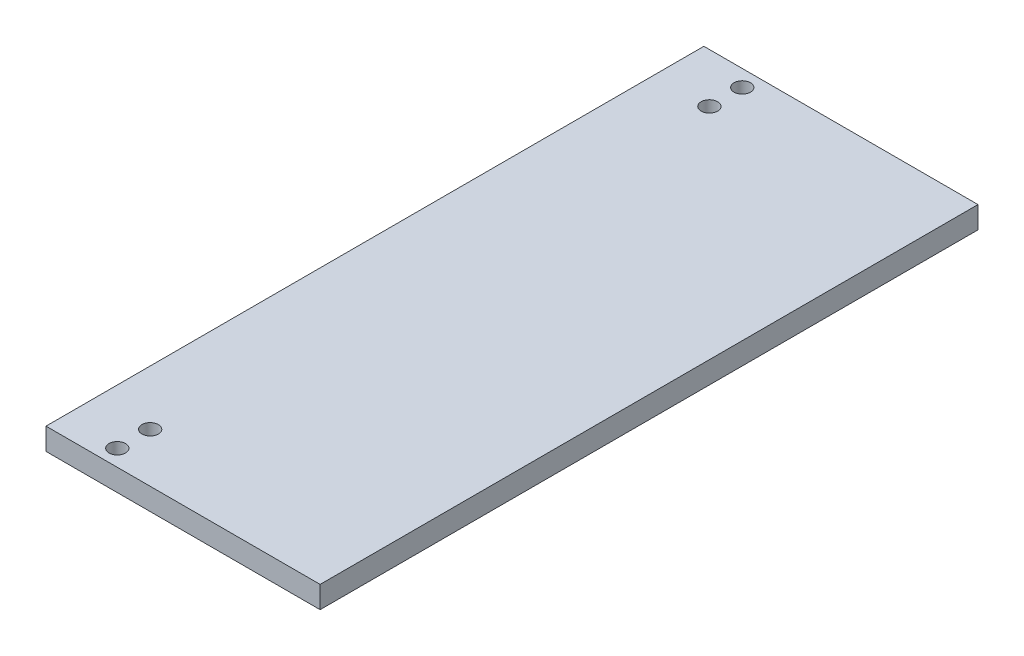
ISO-10303-21;
HEADER;
FILE_DESCRIPTION(('STEP AP214'),'2;1');
FILE_NAME('part.step','',(''),(''),'','','');
FILE_SCHEMA(('AUTOMOTIVE_DESIGN { 1 0 10303 214 1 1 1 1 }'));
ENDSEC;
DATA;
#1=APPLICATION_CONTEXT('core data for automotive mechanical design processes');
#2=APPLICATION_PROTOCOL_DEFINITION('international standard','automotive_design',2000,#1);
#3=PRODUCT_CONTEXT('',#1,'mechanical');
#4=PRODUCT('Part','Part','',(#3));
#5=PRODUCT_RELATED_PRODUCT_CATEGORY('part','',(#4));
#6=PRODUCT_DEFINITION_FORMATION('','',#4);
#7=PRODUCT_DEFINITION_CONTEXT('part definition',#1,'design');
#8=PRODUCT_DEFINITION('design','',#6,#7);
#9=PRODUCT_DEFINITION_SHAPE('','',#8);
#10=(LENGTH_UNIT() NAMED_UNIT(*) SI_UNIT(.MILLI.,.METRE.));
#11=(NAMED_UNIT(*) PLANE_ANGLE_UNIT() SI_UNIT($,.RADIAN.));
#12=(NAMED_UNIT(*) SI_UNIT($,.STERADIAN.) SOLID_ANGLE_UNIT());
#13=UNCERTAINTY_MEASURE_WITH_UNIT(LENGTH_MEASURE(1.E-05),#10,'distance_accuracy_value','');
#14=(GEOMETRIC_REPRESENTATION_CONTEXT(3) GLOBAL_UNCERTAINTY_ASSIGNED_CONTEXT((#13)) GLOBAL_UNIT_ASSIGNED_CONTEXT((#10,
#11,#12)) REPRESENTATION_CONTEXT('',''));
#15=CARTESIAN_POINT('',(0.,0.,0.));
#16=DIRECTION('',(0.,0.,1.));
#17=DIRECTION('',(1.,0.,0.));
#18=AXIS2_PLACEMENT_3D('',#15,#16,#17);
#19=CARTESIAN_POINT('',(25.,4.,-60.));
#20=DIRECTION('',(-1.,0.,0.));
#21=DIRECTION('',(0.,0.,1.));
#22=AXIS2_PLACEMENT_3D('',#19,#20,#21);
#23=PLANE('',#22);
#24=DIRECTION('',(0.,0.,-1.));
#25=VECTOR('',#24,1.);
#26=CARTESIAN_POINT('',(25.,0.,-60.));
#27=LINE('',#26,#25);
#28=CARTESIAN_POINT('',(25.,0.,60.));
#29=VERTEX_POINT('',#28);
#30=CARTESIAN_POINT('',(25.,0.,-60.));
#31=VERTEX_POINT('',#30);
#32=EDGE_CURVE('E96',#29,#31,#27,.T.);
#33=ORIENTED_EDGE('',*,*,#32,.T.);
#34=DIRECTION('',(0.,-1.,0.));
#35=VECTOR('',#34,1.);
#36=CARTESIAN_POINT('',(25.,4.,-60.));
#37=LINE('',#36,#35);
#38=CARTESIAN_POINT('',(25.,4.,-60.));
#39=VERTEX_POINT('',#38);
#40=EDGE_CURVE('E11',#39,#31,#37,.T.);
#41=ORIENTED_EDGE('',*,*,#40,.F.);
#42=DIRECTION('',(0.,0.,-1.));
#43=VECTOR('',#42,1.);
#44=CARTESIAN_POINT('',(25.,4.,-60.));
#45=LINE('',#44,#43);
#46=CARTESIAN_POINT('',(25.,4.,60.));
#47=VERTEX_POINT('',#46);
#48=EDGE_CURVE('E84',#47,#39,#45,.T.);
#49=ORIENTED_EDGE('',*,*,#48,.F.);
#50=DIRECTION('',(0.,-1.,0.));
#51=VECTOR('',#50,1.);
#52=CARTESIAN_POINT('',(25.,4.,60.));
#53=LINE('',#52,#51);
#54=EDGE_CURVE('E92',#47,#29,#53,.T.);
#55=ORIENTED_EDGE('',*,*,#54,.T.);
#56=EDGE_LOOP('',(#33,#41,#49,#55));
#57=FACE_BOUND('',#56,.T.);
#58=ADVANCED_FACE('F33',(#57),#23,.F.);
#59=CARTESIAN_POINT('',(-25.,4.,-60.));
#60=DIRECTION('',(0.,0.,1.));
#61=DIRECTION('',(1.,0.,0.));
#62=AXIS2_PLACEMENT_3D('',#59,#60,#61);
#63=PLANE('',#62);
#64=DIRECTION('',(-1.,0.,0.));
#65=VECTOR('',#64,1.);
#66=CARTESIAN_POINT('',(-25.,0.,-60.));
#67=LINE('',#66,#65);
#68=CARTESIAN_POINT('',(-25.,0.,-60.));
#69=VERTEX_POINT('',#68);
#70=EDGE_CURVE('E88',#31,#69,#67,.T.);
#71=ORIENTED_EDGE('',*,*,#70,.T.);
#72=DIRECTION('',(0.,-1.,0.));
#73=VECTOR('',#72,1.);
#74=CARTESIAN_POINT('',(-25.,4.,-60.));
#75=LINE('',#74,#73);
#76=CARTESIAN_POINT('',(-25.,4.,-60.));
#77=VERTEX_POINT('',#76);
#78=EDGE_CURVE('E41',#77,#69,#75,.T.);
#79=ORIENTED_EDGE('',*,*,#78,.F.);
#80=DIRECTION('',(-1.,0.,0.));
#81=VECTOR('',#80,1.);
#82=CARTESIAN_POINT('',(-25.,4.,-60.));
#83=LINE('',#82,#81);
#84=EDGE_CURVE('E79',#39,#77,#83,.T.);
#85=ORIENTED_EDGE('',*,*,#84,.F.);
#86=ORIENTED_EDGE('',*,*,#40,.T.);
#87=EDGE_LOOP('',(#71,#79,#85,#86));
#88=FACE_BOUND('',#87,.T.);
#89=ADVANCED_FACE('F87',(#88),#63,.F.);
#90=CARTESIAN_POINT('',(-25.,4.,-60.));
#91=DIRECTION('',(1.,0.,0.));
#92=DIRECTION('',(0.,0.,-1.));
#93=AXIS2_PLACEMENT_3D('',#90,#91,#92);
#94=PLANE('',#93);
#95=DIRECTION('',(0.,0.,1.));
#96=VECTOR('',#95,1.);
#97=CARTESIAN_POINT('',(-25.,0.,-60.));
#98=LINE('',#97,#96);
#99=CARTESIAN_POINT('',(-25.,0.,60.));
#100=VERTEX_POINT('',#99);
#101=EDGE_CURVE('E66',#69,#100,#98,.T.);
#102=ORIENTED_EDGE('',*,*,#101,.T.);
#103=DIRECTION('',(0.,-1.,0.));
#104=VECTOR('',#103,1.);
#105=CARTESIAN_POINT('',(-25.,4.,60.));
#106=LINE('',#105,#104);
#107=CARTESIAN_POINT('',(-25.,4.,60.));
#108=VERTEX_POINT('',#107);
#109=EDGE_CURVE('E89',#108,#100,#106,.T.);
#110=ORIENTED_EDGE('',*,*,#109,.F.);
#111=DIRECTION('',(0.,0.,1.));
#112=VECTOR('',#111,1.);
#113=CARTESIAN_POINT('',(-25.,4.,-60.));
#114=LINE('',#113,#112);
#115=EDGE_CURVE('E82',#77,#108,#114,.T.);
#116=ORIENTED_EDGE('',*,*,#115,.F.);
#117=ORIENTED_EDGE('',*,*,#78,.T.);
#118=EDGE_LOOP('',(#102,#110,#116,#117));
#119=FACE_BOUND('',#118,.T.);
#120=ADVANCED_FACE('F90',(#119),#94,.F.);
#121=CARTESIAN_POINT('',(-25.,4.,60.));
#122=DIRECTION('',(0.,0.,-1.));
#123=DIRECTION('',(-1.,0.,0.));
#124=AXIS2_PLACEMENT_3D('',#121,#122,#123);
#125=PLANE('',#124);
#126=DIRECTION('',(1.,0.,0.));
#127=VECTOR('',#126,1.);
#128=CARTESIAN_POINT('',(-25.,0.,60.));
#129=LINE('',#128,#127);
#130=EDGE_CURVE('E72',#100,#29,#129,.T.);
#131=ORIENTED_EDGE('',*,*,#130,.T.);
#132=ORIENTED_EDGE('',*,*,#54,.F.);
#133=DIRECTION('',(1.,0.,0.));
#134=VECTOR('',#133,1.);
#135=CARTESIAN_POINT('',(-25.,4.,60.));
#136=LINE('',#135,#134);
#137=EDGE_CURVE('E49',#108,#47,#136,.T.);
#138=ORIENTED_EDGE('',*,*,#137,.F.);
#139=ORIENTED_EDGE('',*,*,#109,.T.);
#140=EDGE_LOOP('',(#131,#132,#138,#139));
#141=FACE_BOUND('',#140,.T.);
#142=ADVANCED_FACE('F104',(#141),#125,.F.);
#143=CARTESIAN_POINT('',(0.,4.,0.));
#144=DIRECTION('',(0.,1.,0.));
#145=DIRECTION('',(0.,0.,1.));
#146=AXIS2_PLACEMENT_3D('',#143,#144,#145);
#147=PLANE('',#146);
#148=CARTESIAN_POINT('',(-15.,4.,-57.));
#149=DIRECTION('',(0.,-1.,0.));
#150=DIRECTION('',(0.,0.,-1.));
#151=AXIS2_PLACEMENT_3D('',#148,#149,#150);
#152=CIRCLE('',#151,1.5);
#153=CARTESIAN_POINT('',(-15.,4.,-58.5));
#154=VERTEX_POINT('',#153);
#155=EDGE_CURVE('E99',#154,#154,#152,.T.);
#156=ORIENTED_EDGE('',*,*,#155,.T.);
#157=EDGE_LOOP('',(#156));
#158=FACE_BOUND('',#157,.T.);
#159=CARTESIAN_POINT('',(-15.,4.,-51.));
#160=DIRECTION('',(0.,-1.,0.));
#161=DIRECTION('',(0.,0.,-1.));
#162=AXIS2_PLACEMENT_3D('',#159,#160,#161);
#163=CIRCLE('',#162,1.5);
#164=CARTESIAN_POINT('',(-15.,4.,-52.5));
#165=VERTEX_POINT('',#164);
#166=EDGE_CURVE('E125',#165,#165,#163,.T.);
#167=ORIENTED_EDGE('',*,*,#166,.T.);
#168=EDGE_LOOP('',(#167));
#169=FACE_BOUND('',#168,.T.);
#170=CARTESIAN_POINT('',(-15.,4.,51.));
#171=DIRECTION('',(0.,-1.,0.));
#172=DIRECTION('',(0.,0.,-1.));
#173=AXIS2_PLACEMENT_3D('',#170,#171,#172);
#174=CIRCLE('',#173,1.5);
#175=CARTESIAN_POINT('',(-15.,4.,49.5));
#176=VERTEX_POINT('',#175);
#177=EDGE_CURVE('E119',#176,#176,#174,.T.);
#178=ORIENTED_EDGE('',*,*,#177,.T.);
#179=EDGE_LOOP('',(#178));
#180=FACE_BOUND('',#179,.T.);
#181=CARTESIAN_POINT('',(-15.,4.,57.));
#182=DIRECTION('',(0.,-1.,0.));
#183=DIRECTION('',(0.,0.,-1.));
#184=AXIS2_PLACEMENT_3D('',#181,#182,#183);
#185=CIRCLE('',#184,1.5);
#186=CARTESIAN_POINT('',(-15.,4.,55.5));
#187=VERTEX_POINT('',#186);
#188=EDGE_CURVE('E113',#187,#187,#185,.T.);
#189=ORIENTED_EDGE('',*,*,#188,.T.);
#190=EDGE_LOOP('',(#189));
#191=FACE_BOUND('',#190,.T.);
#192=ORIENTED_EDGE('',*,*,#48,.T.);
#193=ORIENTED_EDGE('',*,*,#84,.T.);
#194=ORIENTED_EDGE('',*,*,#115,.T.);
#195=ORIENTED_EDGE('',*,*,#137,.T.);
#196=EDGE_LOOP('',(#192,#193,#194,#195));
#197=FACE_BOUND('',#196,.T.);
#198=ADVANCED_FACE('F80',(#158,#169,#180,#191,#197),#147,.T.);
#199=CARTESIAN_POINT('',(0.,0.,0.));
#200=DIRECTION('',(0.,1.,0.));
#201=DIRECTION('',(0.,0.,1.));
#202=AXIS2_PLACEMENT_3D('',#199,#200,#201);
#203=PLANE('',#202);
#204=CARTESIAN_POINT('',(-15.,0.,-57.));
#205=DIRECTION('',(0.,-1.,0.));
#206=DIRECTION('',(0.,0.,-1.));
#207=AXIS2_PLACEMENT_3D('',#204,#205,#206);
#208=CIRCLE('',#207,1.5);
#209=CARTESIAN_POINT('',(-15.,0.,-58.5));
#210=VERTEX_POINT('',#209);
#211=EDGE_CURVE('E128',#210,#210,#208,.T.);
#212=ORIENTED_EDGE('',*,*,#211,.F.);
#213=EDGE_LOOP('',(#212));
#214=FACE_BOUND('',#213,.T.);
#215=CARTESIAN_POINT('',(-15.,0.,-51.));
#216=DIRECTION('',(0.,-1.,0.));
#217=DIRECTION('',(0.,0.,-1.));
#218=AXIS2_PLACEMENT_3D('',#215,#216,#217);
#219=CIRCLE('',#218,1.5);
#220=CARTESIAN_POINT('',(-15.,0.,-52.5));
#221=VERTEX_POINT('',#220);
#222=EDGE_CURVE('E122',#221,#221,#219,.T.);
#223=ORIENTED_EDGE('',*,*,#222,.F.);
#224=EDGE_LOOP('',(#223));
#225=FACE_BOUND('',#224,.T.);
#226=CARTESIAN_POINT('',(-15.,0.,51.));
#227=DIRECTION('',(0.,-1.,0.));
#228=DIRECTION('',(0.,0.,-1.));
#229=AXIS2_PLACEMENT_3D('',#226,#227,#228);
#230=CIRCLE('',#229,1.5);
#231=CARTESIAN_POINT('',(-15.,0.,49.5));
#232=VERTEX_POINT('',#231);
#233=EDGE_CURVE('E116',#232,#232,#230,.T.);
#234=ORIENTED_EDGE('',*,*,#233,.F.);
#235=EDGE_LOOP('',(#234));
#236=FACE_BOUND('',#235,.T.);
#237=CARTESIAN_POINT('',(-15.,0.,57.));
#238=DIRECTION('',(0.,-1.,0.));
#239=DIRECTION('',(0.,0.,-1.));
#240=AXIS2_PLACEMENT_3D('',#237,#238,#239);
#241=CIRCLE('',#240,1.5);
#242=CARTESIAN_POINT('',(-15.,0.,55.5));
#243=VERTEX_POINT('',#242);
#244=EDGE_CURVE('E110',#243,#243,#241,.T.);
#245=ORIENTED_EDGE('',*,*,#244,.F.);
#246=EDGE_LOOP('',(#245));
#247=FACE_BOUND('',#246,.T.);
#248=ORIENTED_EDGE('',*,*,#32,.F.);
#249=ORIENTED_EDGE('',*,*,#130,.F.);
#250=ORIENTED_EDGE('',*,*,#101,.F.);
#251=ORIENTED_EDGE('',*,*,#70,.F.);
#252=EDGE_LOOP('',(#248,#249,#250,#251));
#253=FACE_BOUND('',#252,.T.);
#254=ADVANCED_FACE('F107',(#214,#225,#236,#247,#253),#203,.F.);
#255=CARTESIAN_POINT('',(-15.,4.,57.));
#256=DIRECTION('',(0.,-1.,0.));
#257=DIRECTION('',(0.,0.,-1.));
#258=AXIS2_PLACEMENT_3D('',#255,#256,#257);
#259=CYLINDRICAL_SURFACE('',#258,1.5);
#260=ORIENTED_EDGE('',*,*,#188,.F.);
#261=EDGE_LOOP('',(#260));
#262=FACE_BOUND('',#261,.T.);
#263=ORIENTED_EDGE('',*,*,#244,.T.);
#264=EDGE_LOOP('',(#263));
#265=FACE_BOUND('',#264,.T.);
#266=ADVANCED_FACE('F145',(#262,#265),#259,.F.);
#267=CARTESIAN_POINT('',(-15.,4.,51.));
#268=DIRECTION('',(0.,-1.,0.));
#269=DIRECTION('',(0.,0.,-1.));
#270=AXIS2_PLACEMENT_3D('',#267,#268,#269);
#271=CYLINDRICAL_SURFACE('',#270,1.5);
#272=ORIENTED_EDGE('',*,*,#177,.F.);
#273=EDGE_LOOP('',(#272));
#274=FACE_BOUND('',#273,.T.);
#275=ORIENTED_EDGE('',*,*,#233,.T.);
#276=EDGE_LOOP('',(#275));
#277=FACE_BOUND('',#276,.T.);
#278=ADVANCED_FACE('F154',(#274,#277),#271,.F.);
#279=CARTESIAN_POINT('',(-15.,4.,-51.));
#280=DIRECTION('',(0.,-1.,0.));
#281=DIRECTION('',(0.,0.,-1.));
#282=AXIS2_PLACEMENT_3D('',#279,#280,#281);
#283=CYLINDRICAL_SURFACE('',#282,1.5);
#284=ORIENTED_EDGE('',*,*,#166,.F.);
#285=EDGE_LOOP('',(#284));
#286=FACE_BOUND('',#285,.T.);
#287=ORIENTED_EDGE('',*,*,#222,.T.);
#288=EDGE_LOOP('',(#287));
#289=FACE_BOUND('',#288,.T.);
#290=ADVANCED_FACE('F139',(#286,#289),#283,.F.);
#291=CARTESIAN_POINT('',(-15.,4.,-57.));
#292=DIRECTION('',(0.,-1.,0.));
#293=DIRECTION('',(0.,0.,-1.));
#294=AXIS2_PLACEMENT_3D('',#291,#292,#293);
#295=CYLINDRICAL_SURFACE('',#294,1.5);
#296=ORIENTED_EDGE('',*,*,#155,.F.);
#297=EDGE_LOOP('',(#296));
#298=FACE_BOUND('',#297,.T.);
#299=ORIENTED_EDGE('',*,*,#211,.T.);
#300=EDGE_LOOP('',(#299));
#301=FACE_BOUND('',#300,.T.);
#302=ADVANCED_FACE('F136',(#298,#301),#295,.F.);
#303=CLOSED_SHELL('',(#58,#89,#120,#142,#198,#254,#266,#278,#290,#302));
#304=MANIFOLD_SOLID_BREP('B2',#303);
#305=ADVANCED_BREP_SHAPE_REPRESENTATION('',(#18,#304),#14);
#306=SHAPE_DEFINITION_REPRESENTATION(#9,#305);
ENDSEC;
END-ISO-10303-21;
